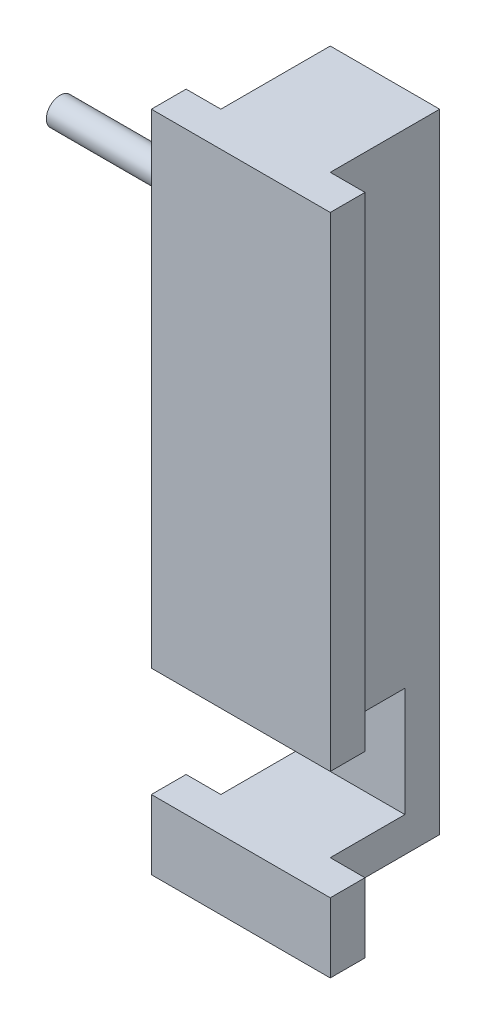
ISO-10303-21;
HEADER;
FILE_DESCRIPTION(('STEP AP214'),'2;1');
FILE_NAME('part.step','',(''),(''),'','','');
FILE_SCHEMA(('AUTOMOTIVE_DESIGN { 1 0 10303 214 1 1 1 1 }'));
ENDSEC;
DATA;
#1=APPLICATION_CONTEXT('core data for automotive mechanical design processes');
#2=APPLICATION_PROTOCOL_DEFINITION('international standard','automotive_design',2000,#1);
#3=PRODUCT_CONTEXT('',#1,'mechanical');
#4=PRODUCT('Part','Part','',(#3));
#5=PRODUCT_RELATED_PRODUCT_CATEGORY('part','',(#4));
#6=PRODUCT_DEFINITION_FORMATION('','',#4);
#7=PRODUCT_DEFINITION_CONTEXT('part definition',#1,'design');
#8=PRODUCT_DEFINITION('design','',#6,#7);
#9=PRODUCT_DEFINITION_SHAPE('','',#8);
#10=(LENGTH_UNIT() NAMED_UNIT(*) SI_UNIT(.MILLI.,.METRE.));
#11=(NAMED_UNIT(*) PLANE_ANGLE_UNIT() SI_UNIT($,.RADIAN.));
#12=(NAMED_UNIT(*) SI_UNIT($,.STERADIAN.) SOLID_ANGLE_UNIT());
#13=UNCERTAINTY_MEASURE_WITH_UNIT(LENGTH_MEASURE(1.E-05),#10,'distance_accuracy_value','');
#14=(GEOMETRIC_REPRESENTATION_CONTEXT(3) GLOBAL_UNCERTAINTY_ASSIGNED_CONTEXT((#13)) GLOBAL_UNIT_ASSIGNED_CONTEXT((#10,
#11,#12)) REPRESENTATION_CONTEXT('',''));
#15=CARTESIAN_POINT('',(0.,0.,0.));
#16=DIRECTION('',(0.,0.,1.));
#17=DIRECTION('',(1.,0.,0.));
#18=AXIS2_PLACEMENT_3D('',#15,#16,#17);
#19=CARTESIAN_POINT('',(32.7,0.,0.));
#20=DIRECTION('',(1.,0.,0.));
#21=DIRECTION('',(0.,0.,-1.));
#22=AXIS2_PLACEMENT_3D('',#19,#20,#21);
#23=PLANE('',#22);
#24=DIRECTION('',(0.,-1.,0.));
#25=VECTOR('',#24,1.);
#26=CARTESIAN_POINT('',(32.7,0.,-6.35));
#27=LINE('',#26,#25);
#28=CARTESIAN_POINT('',(32.7,88.5,-6.35));
#29=VERTEX_POINT('',#28);
#30=CARTESIAN_POINT('',(32.7,0.,-6.35));
#31=VERTEX_POINT('',#30);
#32=EDGE_CURVE('E41',#29,#31,#27,.T.);
#33=ORIENTED_EDGE('',*,*,#32,.F.);
#34=DIRECTION('',(0.,0.,1.));
#35=VECTOR('',#34,1.);
#36=CARTESIAN_POINT('',(32.7,88.5,-26.35));
#37=LINE('',#36,#35);
#38=CARTESIAN_POINT('',(32.7,88.5,0.));
#39=VERTEX_POINT('',#38);
#40=EDGE_CURVE('E57',#29,#39,#37,.T.);
#41=ORIENTED_EDGE('',*,*,#40,.T.);
#42=DIRECTION('',(0.,-1.,0.));
#43=VECTOR('',#42,1.);
#44=CARTESIAN_POINT('',(32.7,88.5,0.));
#45=LINE('',#44,#43);
#46=CARTESIAN_POINT('',(32.7,0.,0.));
#47=VERTEX_POINT('',#46);
#48=EDGE_CURVE('E142',#39,#47,#45,.T.);
#49=ORIENTED_EDGE('',*,*,#48,.T.);
#50=DIRECTION('',(0.,0.,-1.));
#51=VECTOR('',#50,1.);
#52=CARTESIAN_POINT('',(32.7,0.,0.));
#53=LINE('',#52,#51);
#54=EDGE_CURVE('E90',#47,#31,#53,.T.);
#55=ORIENTED_EDGE('',*,*,#54,.T.);
#56=EDGE_LOOP('',(#33,#41,#49,#55));
#57=FACE_BOUND('',#56,.T.);
#58=ADVANCED_FACE('F33',(#57),#23,.T.);
#59=CARTESIAN_POINT('',(0.,0.,0.));
#60=DIRECTION('',(1.,0.,0.));
#61=DIRECTION('',(0.,0.,-1.));
#62=AXIS2_PLACEMENT_3D('',#59,#60,#61);
#63=PLANE('',#62);
#64=DIRECTION('',(0.,0.,1.));
#65=VECTOR('',#64,1.);
#66=CARTESIAN_POINT('',(0.,88.5,-26.35));
#67=LINE('',#66,#65);
#68=CARTESIAN_POINT('',(0.,88.5,-6.35));
#69=VERTEX_POINT('',#68);
#70=CARTESIAN_POINT('',(0.,88.5,0.));
#71=VERTEX_POINT('',#70);
#72=EDGE_CURVE('E81',#69,#71,#67,.T.);
#73=ORIENTED_EDGE('',*,*,#72,.F.);
#74=DIRECTION('',(0.,-1.,0.));
#75=VECTOR('',#74,1.);
#76=CARTESIAN_POINT('',(0.,0.,-6.35));
#77=LINE('',#76,#75);
#78=CARTESIAN_POINT('',(0.,0.,-6.35));
#79=VERTEX_POINT('',#78);
#80=EDGE_CURVE('E163',#69,#79,#77,.T.);
#81=ORIENTED_EDGE('',*,*,#80,.T.);
#82=DIRECTION('',(0.,0.,-1.));
#83=VECTOR('',#82,1.);
#84=CARTESIAN_POINT('',(0.,0.,0.));
#85=LINE('',#84,#83);
#86=CARTESIAN_POINT('',(0.,0.,0.));
#87=VERTEX_POINT('',#86);
#88=EDGE_CURVE('E129',#87,#79,#85,.T.);
#89=ORIENTED_EDGE('',*,*,#88,.F.);
#90=DIRECTION('',(0.,-1.,0.));
#91=VECTOR('',#90,1.);
#92=CARTESIAN_POINT('',(0.,88.5,0.));
#93=LINE('',#92,#91);
#94=EDGE_CURVE('E126',#71,#87,#93,.T.);
#95=ORIENTED_EDGE('',*,*,#94,.F.);
#96=EDGE_LOOP('',(#73,#81,#89,#95));
#97=FACE_BOUND('',#96,.T.);
#98=ADVANCED_FACE('F337',(#97),#63,.F.);
#99=CARTESIAN_POINT('',(32.7,88.5,0.));
#100=DIRECTION('',(0.,0.,-1.));
#101=DIRECTION('',(0.,1.,0.));
#102=AXIS2_PLACEMENT_3D('',#99,#100,#101);
#103=PLANE('',#102);
#104=ORIENTED_EDGE('',*,*,#94,.T.);
#105=DIRECTION('',(-1.,0.,0.));
#106=VECTOR('',#105,1.);
#107=CARTESIAN_POINT('',(32.7,0.,0.));
#108=LINE('',#107,#106);
#109=EDGE_CURVE('E161',#47,#87,#108,.T.);
#110=ORIENTED_EDGE('',*,*,#109,.F.);
#111=ORIENTED_EDGE('',*,*,#48,.F.);
#112=DIRECTION('',(-1.,0.,0.));
#113=VECTOR('',#112,1.);
#114=CARTESIAN_POINT('',(32.7,88.5,0.));
#115=LINE('',#114,#113);
#116=EDGE_CURVE('E125',#39,#71,#115,.T.);
#117=ORIENTED_EDGE('',*,*,#116,.T.);
#118=EDGE_LOOP('',(#104,#110,#111,#117));
#119=FACE_BOUND('',#118,.T.);
#120=ADVANCED_FACE('F35',(#119),#103,.F.);
#121=CARTESIAN_POINT('',(32.7,0.,0.));
#122=DIRECTION('',(0.,1.,0.));
#123=DIRECTION('',(0.,0.,1.));
#124=AXIS2_PLACEMENT_3D('',#121,#122,#123);
#125=PLANE('',#124);
#126=DIRECTION('',(1.,0.,0.));
#127=VECTOR('',#126,1.);
#128=CARTESIAN_POINT('',(32.7,0.,-6.34999999999999));
#129=LINE('',#128,#127);
#130=CARTESIAN_POINT('',(6.35,0.,-6.35));
#131=VERTEX_POINT('',#130);
#132=EDGE_CURVE('E216',#79,#131,#129,.T.);
#133=ORIENTED_EDGE('',*,*,#132,.T.);
#134=DIRECTION('',(0.,0.,-1.));
#135=VECTOR('',#134,1.);
#136=CARTESIAN_POINT('',(6.35,0.,0.));
#137=LINE('',#136,#135);
#138=CARTESIAN_POINT('',(6.35,0.,-20.));
#139=VERTEX_POINT('',#138);
#140=EDGE_CURVE('E130',#131,#139,#137,.T.);
#141=ORIENTED_EDGE('',*,*,#140,.T.);
#142=DIRECTION('',(-1.,0.,0.));
#143=VECTOR('',#142,1.);
#144=CARTESIAN_POINT('',(32.7,0.,-20.));
#145=LINE('',#144,#143);
#146=CARTESIAN_POINT('',(26.35,0.,-20.));
#147=VERTEX_POINT('',#146);
#148=EDGE_CURVE('E158',#147,#139,#145,.T.);
#149=ORIENTED_EDGE('',*,*,#148,.F.);
#150=DIRECTION('',(0.,0.,1.));
#151=VECTOR('',#150,1.);
#152=CARTESIAN_POINT('',(26.35,0.,0.));
#153=LINE('',#152,#151);
#154=CARTESIAN_POINT('',(26.35,0.,-6.35));
#155=VERTEX_POINT('',#154);
#156=EDGE_CURVE('E185',#147,#155,#153,.T.);
#157=ORIENTED_EDGE('',*,*,#156,.T.);
#158=DIRECTION('',(1.,0.,0.));
#159=VECTOR('',#158,1.);
#160=CARTESIAN_POINT('',(32.7,0.,-6.35));
#161=LINE('',#160,#159);
#162=EDGE_CURVE('E173',#155,#31,#161,.T.);
#163=ORIENTED_EDGE('',*,*,#162,.T.);
#164=ORIENTED_EDGE('',*,*,#54,.F.);
#165=ORIENTED_EDGE('',*,*,#109,.T.);
#166=ORIENTED_EDGE('',*,*,#88,.T.);
#167=EDGE_LOOP('',(#133,#141,#149,#157,#163,#164,#165,#166));
#168=FACE_BOUND('',#167,.T.);
#169=ADVANCED_FACE('F182',(#168),#125,.F.);
#170=CARTESIAN_POINT('',(32.7,0.,-20.));
#171=DIRECTION('',(0.,0.,-1.));
#172=DIRECTION('',(0.,1.,0.));
#173=AXIS2_PLACEMENT_3D('',#170,#171,#172);
#174=PLANE('',#173);
#175=ORIENTED_EDGE('',*,*,#148,.T.);
#176=DIRECTION('',(0.,-1.,0.));
#177=VECTOR('',#176,1.);
#178=CARTESIAN_POINT('',(6.35,0.,-20.));
#179=LINE('',#178,#177);
#180=CARTESIAN_POINT('',(6.35,-20.,-20.));
#181=VERTEX_POINT('',#180);
#182=EDGE_CURVE('E196',#139,#181,#179,.T.);
#183=ORIENTED_EDGE('',*,*,#182,.T.);
#184=DIRECTION('',(-1.,0.,0.));
#185=VECTOR('',#184,1.);
#186=CARTESIAN_POINT('',(32.7,-20.,-20.));
#187=LINE('',#186,#185);
#188=CARTESIAN_POINT('',(26.35,-20.,-20.));
#189=VERTEX_POINT('',#188);
#190=EDGE_CURVE('E155',#189,#181,#187,.T.);
#191=ORIENTED_EDGE('',*,*,#190,.F.);
#192=DIRECTION('',(0.,1.,0.));
#193=VECTOR('',#192,1.);
#194=CARTESIAN_POINT('',(26.35,0.,-20.));
#195=LINE('',#194,#193);
#196=EDGE_CURVE('E206',#189,#147,#195,.T.);
#197=ORIENTED_EDGE('',*,*,#196,.T.);
#198=EDGE_LOOP('',(#175,#183,#191,#197));
#199=FACE_BOUND('',#198,.T.);
#200=ADVANCED_FACE('F321',(#199),#174,.F.);
#201=CARTESIAN_POINT('',(32.7,-20.,-20.));
#202=DIRECTION('',(0.,-1.,0.));
#203=DIRECTION('',(0.,0.,-1.));
#204=AXIS2_PLACEMENT_3D('',#201,#202,#203);
#205=PLANE('',#204);
#206=ORIENTED_EDGE('',*,*,#190,.T.);
#207=DIRECTION('',(0.,0.,1.));
#208=VECTOR('',#207,1.);
#209=CARTESIAN_POINT('',(6.35,-20.,-20.));
#210=LINE('',#209,#208);
#211=CARTESIAN_POINT('',(6.35,-20.,-6.35));
#212=VERTEX_POINT('',#211);
#213=EDGE_CURVE('E199',#181,#212,#210,.T.);
#214=ORIENTED_EDGE('',*,*,#213,.T.);
#215=DIRECTION('',(-1.,0.,0.));
#216=VECTOR('',#215,1.);
#217=CARTESIAN_POINT('',(32.7,-20.,-6.34999999999999));
#218=LINE('',#217,#216);
#219=CARTESIAN_POINT('',(0.,-20.,-6.35));
#220=VERTEX_POINT('',#219);
#221=EDGE_CURVE('E218',#212,#220,#218,.T.);
#222=ORIENTED_EDGE('',*,*,#221,.T.);
#223=DIRECTION('',(0.,0.,1.));
#224=VECTOR('',#223,1.);
#225=CARTESIAN_POINT('',(0.,-20.,-20.));
#226=LINE('',#225,#224);
#227=CARTESIAN_POINT('',(0.,-20.,0.));
#228=VERTEX_POINT('',#227);
#229=EDGE_CURVE('E133',#220,#228,#226,.T.);
#230=ORIENTED_EDGE('',*,*,#229,.T.);
#231=DIRECTION('',(-1.,0.,0.));
#232=VECTOR('',#231,1.);
#233=CARTESIAN_POINT('',(32.7,-20.,0.));
#234=LINE('',#233,#232);
#235=CARTESIAN_POINT('',(32.7,-20.,0.));
#236=VERTEX_POINT('',#235);
#237=EDGE_CURVE('E116',#236,#228,#234,.T.);
#238=ORIENTED_EDGE('',*,*,#237,.F.);
#239=DIRECTION('',(0.,0.,1.));
#240=VECTOR('',#239,1.);
#241=CARTESIAN_POINT('',(32.7,-20.,-20.));
#242=LINE('',#241,#240);
#243=CARTESIAN_POINT('',(32.7,-20.,-6.35));
#244=VERTEX_POINT('',#243);
#245=EDGE_CURVE('E103',#244,#236,#242,.T.);
#246=ORIENTED_EDGE('',*,*,#245,.F.);
#247=DIRECTION('',(-1.,0.,0.));
#248=VECTOR('',#247,1.);
#249=CARTESIAN_POINT('',(32.7,-20.,-6.35));
#250=LINE('',#249,#248);
#251=CARTESIAN_POINT('',(26.35,-20.,-6.35));
#252=VERTEX_POINT('',#251);
#253=EDGE_CURVE('E187',#244,#252,#250,.T.);
#254=ORIENTED_EDGE('',*,*,#253,.T.);
#255=DIRECTION('',(0.,0.,-1.));
#256=VECTOR('',#255,1.);
#257=CARTESIAN_POINT('',(26.35,-20.,-20.));
#258=LINE('',#257,#256);
#259=EDGE_CURVE('E209',#252,#189,#258,.T.);
#260=ORIENTED_EDGE('',*,*,#259,.T.);
#261=EDGE_LOOP('',(#206,#214,#222,#230,#238,#246,#254,#260));
#262=FACE_BOUND('',#261,.T.);
#263=ADVANCED_FACE('F325',(#262),#205,.F.);
#264=CARTESIAN_POINT('',(32.7,-20.,0.));
#265=DIRECTION('',(0.,0.,-1.));
#266=DIRECTION('',(0.,1.,0.));
#267=AXIS2_PLACEMENT_3D('',#264,#265,#266);
#268=PLANE('',#267);
#269=DIRECTION('',(0.,-1.,0.));
#270=VECTOR('',#269,1.);
#271=CARTESIAN_POINT('',(0.,-20.,0.));
#272=LINE('',#271,#270);
#273=CARTESIAN_POINT('',(0.,-32.7,0.));
#274=VERTEX_POINT('',#273);
#275=EDGE_CURVE('E112',#228,#274,#272,.T.);
#276=ORIENTED_EDGE('',*,*,#275,.T.);
#277=DIRECTION('',(-1.,0.,0.));
#278=VECTOR('',#277,1.);
#279=CARTESIAN_POINT('',(32.7,-32.7,0.));
#280=LINE('',#279,#278);
#281=CARTESIAN_POINT('',(32.7,-32.7,0.));
#282=VERTEX_POINT('',#281);
#283=EDGE_CURVE('E109',#282,#274,#280,.T.);
#284=ORIENTED_EDGE('',*,*,#283,.F.);
#285=DIRECTION('',(0.,-1.,0.));
#286=VECTOR('',#285,1.);
#287=CARTESIAN_POINT('',(32.7,-20.,0.));
#288=LINE('',#287,#286);
#289=EDGE_CURVE('E96',#236,#282,#288,.T.);
#290=ORIENTED_EDGE('',*,*,#289,.F.);
#291=ORIENTED_EDGE('',*,*,#237,.T.);
#292=EDGE_LOOP('',(#276,#284,#290,#291));
#293=FACE_BOUND('',#292,.T.);
#294=ADVANCED_FACE('F110',(#293),#268,.F.);
#295=CARTESIAN_POINT('',(32.7,-32.7,0.));
#296=DIRECTION('',(0.,1.,0.));
#297=DIRECTION('',(0.,0.,1.));
#298=AXIS2_PLACEMENT_3D('',#295,#296,#297);
#299=PLANE('',#298);
#300=DIRECTION('',(0.,0.,-1.));
#301=VECTOR('',#300,1.);
#302=CARTESIAN_POINT('',(0.,-32.7,0.));
#303=LINE('',#302,#301);
#304=CARTESIAN_POINT('',(0.,-32.7,-6.35));
#305=VERTEX_POINT('',#304);
#306=EDGE_CURVE('E136',#274,#305,#303,.T.);
#307=ORIENTED_EDGE('',*,*,#306,.T.);
#308=DIRECTION('',(-1.,0.,0.));
#309=VECTOR('',#308,1.);
#310=CARTESIAN_POINT('',(32.7,-32.7,-6.35));
#311=LINE('',#310,#309);
#312=CARTESIAN_POINT('',(32.7,-32.7,-6.35));
#313=VERTEX_POINT('',#312);
#314=EDGE_CURVE('E117',#313,#305,#311,.T.);
#315=ORIENTED_EDGE('',*,*,#314,.F.);
#316=DIRECTION('',(0.,0.,-1.));
#317=VECTOR('',#316,1.);
#318=CARTESIAN_POINT('',(32.7,-32.7,0.));
#319=LINE('',#318,#317);
#320=EDGE_CURVE('E100',#282,#313,#319,.T.);
#321=ORIENTED_EDGE('',*,*,#320,.F.);
#322=ORIENTED_EDGE('',*,*,#283,.T.);
#323=EDGE_LOOP('',(#307,#315,#321,#322));
#324=FACE_BOUND('',#323,.T.);
#325=ADVANCED_FACE('F119',(#324),#299,.F.);
#326=CARTESIAN_POINT('',(32.7,-32.7,-6.35));
#327=DIRECTION('',(0.,0.,1.));
#328=DIRECTION('',(1.,0.,0.));
#329=AXIS2_PLACEMENT_3D('',#326,#327,#328);
#330=PLANE('',#329);
#331=ORIENTED_EDGE('',*,*,#314,.T.);
#332=DIRECTION('',(0.,1.,0.));
#333=VECTOR('',#332,1.);
#334=CARTESIAN_POINT('',(0.,-32.7,-6.35));
#335=LINE('',#334,#333);
#336=EDGE_CURVE('E138',#305,#220,#335,.T.);
#337=ORIENTED_EDGE('',*,*,#336,.T.);
#338=ORIENTED_EDGE('',*,*,#221,.F.);
#339=DIRECTION('',(0.,1.,0.));
#340=VECTOR('',#339,1.);
#341=CARTESIAN_POINT('',(6.35,-32.7,-6.35));
#342=LINE('',#341,#340);
#343=CARTESIAN_POINT('',(6.35,-26.35,-6.35));
#344=VERTEX_POINT('',#343);
#345=EDGE_CURVE('E236',#344,#212,#342,.T.);
#346=ORIENTED_EDGE('',*,*,#345,.F.);
#347=DIRECTION('',(-1.,0.,0.));
#348=VECTOR('',#347,1.);
#349=CARTESIAN_POINT('',(32.7,-26.35,-6.35));
#350=LINE('',#349,#348);
#351=CARTESIAN_POINT('',(26.35,-26.35,-6.35));
#352=VERTEX_POINT('',#351);
#353=EDGE_CURVE('E150',#352,#344,#350,.T.);
#354=ORIENTED_EDGE('',*,*,#353,.F.);
#355=DIRECTION('',(0.,1.,0.));
#356=VECTOR('',#355,1.);
#357=CARTESIAN_POINT('',(26.35,-32.7,-6.35));
#358=LINE('',#357,#356);
#359=EDGE_CURVE('E227',#352,#252,#358,.T.);
#360=ORIENTED_EDGE('',*,*,#359,.T.);
#361=ORIENTED_EDGE('',*,*,#253,.F.);
#362=DIRECTION('',(0.,1.,0.));
#363=VECTOR('',#362,1.);
#364=CARTESIAN_POINT('',(32.7,-32.7,-6.35));
#365=LINE('',#364,#363);
#366=EDGE_CURVE('E48',#313,#244,#365,.T.);
#367=ORIENTED_EDGE('',*,*,#366,.F.);
#368=EDGE_LOOP('',(#331,#337,#338,#346,#354,#360,#361,#367));
#369=FACE_BOUND('',#368,.T.);
#370=ADVANCED_FACE('F327',(#369),#330,.F.);
#371=CARTESIAN_POINT('',(32.7,-26.35,-6.35));
#372=DIRECTION('',(0.,1.,0.));
#373=DIRECTION('',(0.,0.,1.));
#374=AXIS2_PLACEMENT_3D('',#371,#372,#373);
#375=PLANE('',#374);
#376=ORIENTED_EDGE('',*,*,#353,.T.);
#377=DIRECTION('',(0.,0.,-1.));
#378=VECTOR('',#377,1.);
#379=CARTESIAN_POINT('',(6.35,-26.35,-6.35));
#380=LINE('',#379,#378);
#381=CARTESIAN_POINT('',(6.35,-26.35,-26.35));
#382=VERTEX_POINT('',#381);
#383=EDGE_CURVE('E202',#344,#382,#380,.T.);
#384=ORIENTED_EDGE('',*,*,#383,.T.);
#385=DIRECTION('',(-1.,0.,0.));
#386=VECTOR('',#385,1.);
#387=CARTESIAN_POINT('',(32.7,-26.35,-26.35));
#388=LINE('',#387,#386);
#389=CARTESIAN_POINT('',(26.35,-26.35,-26.35));
#390=VERTEX_POINT('',#389);
#391=EDGE_CURVE('E147',#390,#382,#388,.T.);
#392=ORIENTED_EDGE('',*,*,#391,.F.);
#393=DIRECTION('',(0.,0.,1.));
#394=VECTOR('',#393,1.);
#395=CARTESIAN_POINT('',(26.35,-26.35,-6.35));
#396=LINE('',#395,#394);
#397=EDGE_CURVE('E186',#390,#352,#396,.T.);
#398=ORIENTED_EDGE('',*,*,#397,.T.);
#399=EDGE_LOOP('',(#376,#384,#392,#398));
#400=FACE_BOUND('',#399,.T.);
#401=ADVANCED_FACE('F331',(#400),#375,.F.);
#402=CARTESIAN_POINT('',(32.7,-26.35,-26.35));
#403=DIRECTION('',(0.,0.,1.));
#404=DIRECTION('',(1.,0.,0.));
#405=AXIS2_PLACEMENT_3D('',#402,#403,#404);
#406=PLANE('',#405);
#407=ORIENTED_EDGE('',*,*,#391,.T.);
#408=DIRECTION('',(0.,1.,0.));
#409=VECTOR('',#408,1.);
#410=CARTESIAN_POINT('',(6.35,-32.7,-26.35));
#411=LINE('',#410,#409);
#412=CARTESIAN_POINT('',(6.35,88.5,-26.35));
#413=VERTEX_POINT('',#412);
#414=EDGE_CURVE('E221',#382,#413,#411,.T.);
#415=ORIENTED_EDGE('',*,*,#414,.T.);
#416=DIRECTION('',(-1.,0.,0.));
#417=VECTOR('',#416,1.);
#418=CARTESIAN_POINT('',(32.7,88.5,-26.35));
#419=LINE('',#418,#417);
#420=CARTESIAN_POINT('',(26.35,88.5,-26.35));
#421=VERTEX_POINT('',#420);
#422=EDGE_CURVE('E144',#421,#413,#419,.T.);
#423=ORIENTED_EDGE('',*,*,#422,.F.);
#424=DIRECTION('',(0.,1.,0.));
#425=VECTOR('',#424,1.);
#426=CARTESIAN_POINT('',(26.35,-32.7,-26.35));
#427=LINE('',#426,#425);
#428=EDGE_CURVE('E222',#390,#421,#427,.T.);
#429=ORIENTED_EDGE('',*,*,#428,.F.);
#430=EDGE_LOOP('',(#407,#415,#423,#429));
#431=FACE_BOUND('',#430,.T.);
#432=ADVANCED_FACE('F283',(#431),#406,.F.);
#433=CARTESIAN_POINT('',(32.7,88.5,-26.35));
#434=DIRECTION('',(0.,-1.,0.));
#435=DIRECTION('',(0.,0.,-1.));
#436=AXIS2_PLACEMENT_3D('',#433,#434,#435);
#437=PLANE('',#436);
#438=ORIENTED_EDGE('',*,*,#422,.T.);
#439=DIRECTION('',(0.,0.,-1.));
#440=VECTOR('',#439,1.);
#441=CARTESIAN_POINT('',(6.35,88.5,-26.35));
#442=LINE('',#441,#440);
#443=CARTESIAN_POINT('',(6.35,88.5,-6.35));
#444=VERTEX_POINT('',#443);
#445=EDGE_CURVE('E237',#444,#413,#442,.T.);
#446=ORIENTED_EDGE('',*,*,#445,.F.);
#447=DIRECTION('',(1.,0.,0.));
#448=VECTOR('',#447,1.);
#449=CARTESIAN_POINT('',(6.35,88.5,-6.35));
#450=LINE('',#449,#448);
#451=EDGE_CURVE('E242',#69,#444,#450,.T.);
#452=ORIENTED_EDGE('',*,*,#451,.F.);
#453=ORIENTED_EDGE('',*,*,#72,.T.);
#454=ORIENTED_EDGE('',*,*,#116,.F.);
#455=ORIENTED_EDGE('',*,*,#40,.F.);
#456=DIRECTION('',(1.,0.,0.));
#457=VECTOR('',#456,1.);
#458=CARTESIAN_POINT('',(32.7,88.5,-6.35));
#459=LINE('',#458,#457);
#460=CARTESIAN_POINT('',(26.35,88.5,-6.35));
#461=VERTEX_POINT('',#460);
#462=EDGE_CURVE('E177',#461,#29,#459,.T.);
#463=ORIENTED_EDGE('',*,*,#462,.F.);
#464=DIRECTION('',(0.,0.,1.));
#465=VECTOR('',#464,1.);
#466=CARTESIAN_POINT('',(26.35,88.5,-6.35));
#467=LINE('',#466,#465);
#468=EDGE_CURVE('E229',#421,#461,#467,.T.);
#469=ORIENTED_EDGE('',*,*,#468,.F.);
#470=EDGE_LOOP('',(#438,#446,#452,#453,#454,#455,#463,#469));
#471=FACE_BOUND('',#470,.T.);
#472=ADVANCED_FACE('F275',(#471),#437,.F.);
#473=ORIENTED_EDGE('',*,*,#366,.T.);
#474=ORIENTED_EDGE('',*,*,#245,.T.);
#475=ORIENTED_EDGE('',*,*,#289,.T.);
#476=ORIENTED_EDGE('',*,*,#320,.T.);
#477=EDGE_LOOP('',(#473,#474,#475,#476));
#478=FACE_BOUND('',#477,.T.);
#479=ADVANCED_FACE('F98',(#478),#23,.T.);
#480=ORIENTED_EDGE('',*,*,#229,.F.);
#481=ORIENTED_EDGE('',*,*,#336,.F.);
#482=ORIENTED_EDGE('',*,*,#306,.F.);
#483=ORIENTED_EDGE('',*,*,#275,.F.);
#484=EDGE_LOOP('',(#480,#481,#482,#483));
#485=FACE_BOUND('',#484,.T.);
#486=ADVANCED_FACE('F260',(#485),#63,.F.);
#487=CARTESIAN_POINT('',(6.35,-32.7,-26.35));
#488=DIRECTION('',(1.,0.,0.));
#489=DIRECTION('',(0.,0.,-1.));
#490=AXIS2_PLACEMENT_3D('',#487,#488,#489);
#491=PLANE('',#490);
#492=CARTESIAN_POINT('',(6.35,69.86,-9.99999999999999));
#493=DIRECTION('',(1.,0.,0.));
#494=DIRECTION('',(0.,0.,-1.));
#495=AXIS2_PLACEMENT_3D('',#492,#493,#494);
#496=CIRCLE('',#495,2.5);
#497=CARTESIAN_POINT('',(6.35,69.86,-12.5));
#498=VERTEX_POINT('',#497);
#499=EDGE_CURVE('E11',#498,#498,#496,.F.);
#500=ORIENTED_EDGE('',*,*,#499,.F.);
#501=EDGE_LOOP('',(#500));
#502=FACE_BOUND('',#501,.T.);
#503=EDGE_CURVE('E233',#131,#444,#342,.T.);
#504=ORIENTED_EDGE('',*,*,#503,.T.);
#505=ORIENTED_EDGE('',*,*,#445,.T.);
#506=ORIENTED_EDGE('',*,*,#414,.F.);
#507=ORIENTED_EDGE('',*,*,#383,.F.);
#508=ORIENTED_EDGE('',*,*,#345,.T.);
#509=ORIENTED_EDGE('',*,*,#213,.F.);
#510=ORIENTED_EDGE('',*,*,#182,.F.);
#511=ORIENTED_EDGE('',*,*,#140,.F.);
#512=EDGE_LOOP('',(#504,#505,#506,#507,#508,#509,#510,#511));
#513=FACE_BOUND('',#512,.T.);
#514=ADVANCED_FACE('F256',(#502,#513),#491,.F.);
#515=CARTESIAN_POINT('',(6.35,-32.7,-6.35));
#516=DIRECTION('',(0.,0.,1.));
#517=DIRECTION('',(1.,0.,0.));
#518=AXIS2_PLACEMENT_3D('',#515,#516,#517);
#519=PLANE('',#518);
#520=ORIENTED_EDGE('',*,*,#80,.F.);
#521=ORIENTED_EDGE('',*,*,#451,.T.);
#522=ORIENTED_EDGE('',*,*,#503,.F.);
#523=ORIENTED_EDGE('',*,*,#132,.F.);
#524=EDGE_LOOP('',(#520,#521,#522,#523));
#525=FACE_BOUND('',#524,.T.);
#526=ADVANCED_FACE('F259',(#525),#519,.F.);
#527=CARTESIAN_POINT('',(26.35,-32.7,-6.35));
#528=DIRECTION('',(-1.,0.,0.));
#529=DIRECTION('',(0.,0.,1.));
#530=AXIS2_PLACEMENT_3D('',#527,#528,#529);
#531=PLANE('',#530);
#532=ORIENTED_EDGE('',*,*,#196,.F.);
#533=ORIENTED_EDGE('',*,*,#259,.F.);
#534=ORIENTED_EDGE('',*,*,#359,.F.);
#535=ORIENTED_EDGE('',*,*,#397,.F.);
#536=ORIENTED_EDGE('',*,*,#428,.T.);
#537=ORIENTED_EDGE('',*,*,#468,.T.);
#538=EDGE_CURVE('E225',#155,#461,#358,.T.);
#539=ORIENTED_EDGE('',*,*,#538,.F.);
#540=ORIENTED_EDGE('',*,*,#156,.F.);
#541=EDGE_LOOP('',(#532,#533,#534,#535,#536,#537,#539,#540));
#542=FACE_BOUND('',#541,.T.);
#543=ADVANCED_FACE('F322',(#542),#531,.F.);
#544=CARTESIAN_POINT('',(32.7,-32.7,-6.35));
#545=DIRECTION('',(0.,0.,1.));
#546=DIRECTION('',(1.,0.,0.));
#547=AXIS2_PLACEMENT_3D('',#544,#545,#546);
#548=PLANE('',#547);
#549=ORIENTED_EDGE('',*,*,#538,.T.);
#550=ORIENTED_EDGE('',*,*,#462,.T.);
#551=ORIENTED_EDGE('',*,*,#32,.T.);
#552=ORIENTED_EDGE('',*,*,#162,.F.);
#553=EDGE_LOOP('',(#549,#550,#551,#552));
#554=FACE_BOUND('',#553,.T.);
#555=ADVANCED_FACE('F171',(#554),#548,.F.);
#556=CARTESIAN_POINT('',(-26.7,69.86,-9.99999999999999));
#557=DIRECTION('',(1.,0.,0.));
#558=DIRECTION('',(0.,0.,-1.));
#559=AXIS2_PLACEMENT_3D('',#556,#557,#558);
#560=CYLINDRICAL_SURFACE('',#559,2.5);
#561=CARTESIAN_POINT('',(-26.7,69.86,-9.99999999999999));
#562=DIRECTION('',(-1.,0.,0.));
#563=DIRECTION('',(0.,0.,1.));
#564=AXIS2_PLACEMENT_3D('',#561,#562,#563);
#565=CIRCLE('',#564,2.5);
#566=CARTESIAN_POINT('',(-26.7,69.86,-7.49999999999999));
#567=VERTEX_POINT('',#566);
#568=EDGE_CURVE('E232',#567,#567,#565,.T.);
#569=ORIENTED_EDGE('',*,*,#568,.F.);
#570=EDGE_LOOP('',(#569));
#571=FACE_BOUND('',#570,.T.);
#572=ORIENTED_EDGE('',*,*,#499,.T.);
#573=EDGE_LOOP('',(#572));
#574=FACE_BOUND('',#573,.T.);
#575=ADVANCED_FACE('F250',(#571,#574),#560,.T.);
#576=CARTESIAN_POINT('',(-26.7,69.86,-9.99999999999999));
#577=DIRECTION('',(-1.,0.,0.));
#578=DIRECTION('',(0.,0.,1.));
#579=AXIS2_PLACEMENT_3D('',#576,#577,#578);
#580=PLANE('',#579);
#581=ORIENTED_EDGE('',*,*,#568,.T.);
#582=EDGE_LOOP('',(#581));
#583=FACE_BOUND('',#582,.T.);
#584=ADVANCED_FACE('F248',(#583),#580,.T.);
#585=CLOSED_SHELL('',(#58,#98,#120,#169,#200,#263,#294,#325,#370,#401,#432,#472,#479,#486,#514,
#526,#543,#555,#575,#584));
#586=MANIFOLD_SOLID_BREP('B2',#585);
#587=ADVANCED_BREP_SHAPE_REPRESENTATION('',(#18,#586),#14);
#588=SHAPE_DEFINITION_REPRESENTATION(#9,#587);
ENDSEC;
END-ISO-10303-21;
